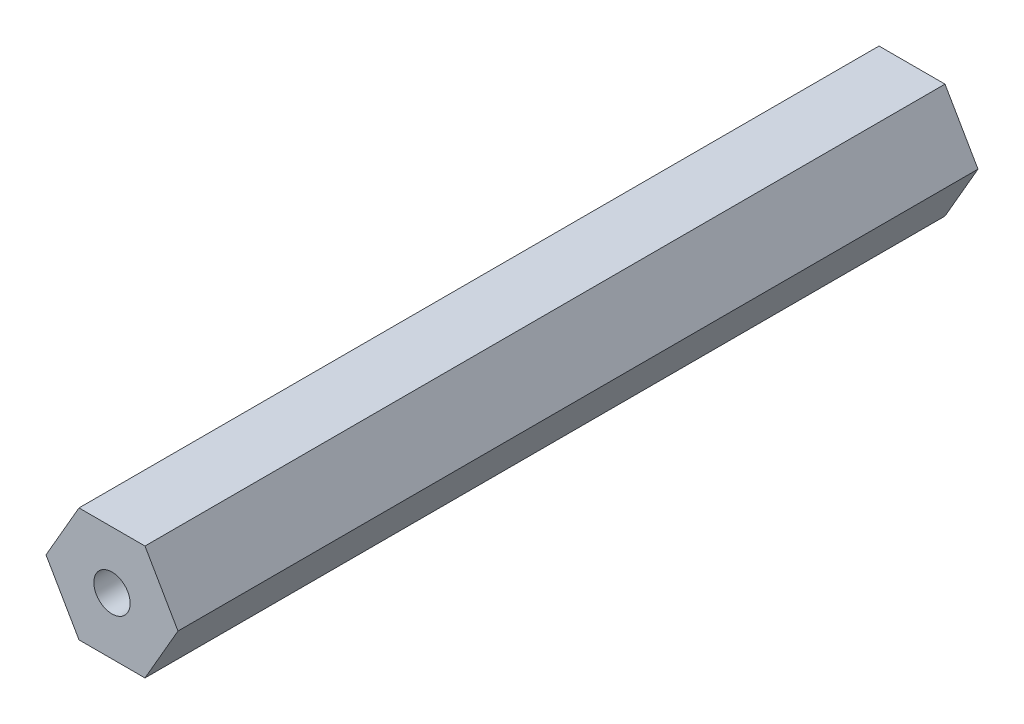
ISO-10303-21;
HEADER;
FILE_DESCRIPTION(('STEP AP214'),'2;1');
FILE_NAME('part.step','',(''),(''),'','','');
FILE_SCHEMA(('AUTOMOTIVE_DESIGN { 1 0 10303 214 1 1 1 1 }'));
ENDSEC;
DATA;
#1=APPLICATION_CONTEXT('core data for automotive mechanical design processes');
#2=APPLICATION_PROTOCOL_DEFINITION('international standard','automotive_design',2000,#1);
#3=PRODUCT_CONTEXT('',#1,'mechanical');
#4=PRODUCT('Part','Part','',(#3));
#5=PRODUCT_RELATED_PRODUCT_CATEGORY('part','',(#4));
#6=PRODUCT_DEFINITION_FORMATION('','',#4);
#7=PRODUCT_DEFINITION_CONTEXT('part definition',#1,'design');
#8=PRODUCT_DEFINITION('design','',#6,#7);
#9=PRODUCT_DEFINITION_SHAPE('','',#8);
#10=(LENGTH_UNIT() NAMED_UNIT(*) SI_UNIT(.MILLI.,.METRE.));
#11=(NAMED_UNIT(*) PLANE_ANGLE_UNIT() SI_UNIT($,.RADIAN.));
#12=(NAMED_UNIT(*) SI_UNIT($,.STERADIAN.) SOLID_ANGLE_UNIT());
#13=UNCERTAINTY_MEASURE_WITH_UNIT(LENGTH_MEASURE(1.E-05),#10,'distance_accuracy_value','');
#14=(GEOMETRIC_REPRESENTATION_CONTEXT(3) GLOBAL_UNCERTAINTY_ASSIGNED_CONTEXT((#13)) GLOBAL_UNIT_ASSIGNED_CONTEXT((#10,
#11,#12)) REPRESENTATION_CONTEXT('',''));
#15=CARTESIAN_POINT('',(0.,0.,0.));
#16=DIRECTION('',(0.,0.,1.));
#17=DIRECTION('',(1.,0.,0.));
#18=AXIS2_PLACEMENT_3D('',#15,#16,#17);
#19=CARTESIAN_POINT('',(3.66617420935412,-6.35,44.45));
#20=DIRECTION('',(-0.866025403784439,0.499999999999999,0.));
#21=DIRECTION('',(-0.499999999999999,-0.866025403784439,0.));
#22=AXIS2_PLACEMENT_3D('',#19,#20,#21);
#23=PLANE('',#22);
#24=DIRECTION('',(0.499999999999999,0.866025403784439,0.));
#25=VECTOR('',#24,1.);
#26=CARTESIAN_POINT('',(3.66617420935412,-6.35,-44.45));
#27=LINE('',#26,#25);
#28=CARTESIAN_POINT('',(3.66617420935412,-6.35,-44.45));
#29=VERTEX_POINT('',#28);
#30=CARTESIAN_POINT('',(7.33234841870824,0.,-44.45));
#31=VERTEX_POINT('',#30);
#32=EDGE_CURVE('E128',#29,#31,#27,.T.);
#33=ORIENTED_EDGE('',*,*,#32,.T.);
#34=DIRECTION('',(0.,0.,-1.));
#35=VECTOR('',#34,1.);
#36=CARTESIAN_POINT('',(7.33234841870824,0.,44.45));
#37=LINE('',#36,#35);
#38=CARTESIAN_POINT('',(7.33234841870824,0.,44.45));
#39=VERTEX_POINT('',#38);
#40=EDGE_CURVE('E11',#39,#31,#37,.T.);
#41=ORIENTED_EDGE('',*,*,#40,.F.);
#42=DIRECTION('',(0.499999999999999,0.866025403784439,0.));
#43=VECTOR('',#42,1.);
#44=CARTESIAN_POINT('',(3.66617420935412,-6.35,44.45));
#45=LINE('',#44,#43);
#46=CARTESIAN_POINT('',(3.66617420935412,-6.35,44.45));
#47=VERTEX_POINT('',#46);
#48=EDGE_CURVE('E139',#47,#39,#45,.T.);
#49=ORIENTED_EDGE('',*,*,#48,.F.);
#50=DIRECTION('',(0.,0.,-1.));
#51=VECTOR('',#50,1.);
#52=CARTESIAN_POINT('',(3.66617420935412,-6.35,44.45));
#53=LINE('',#52,#51);
#54=EDGE_CURVE('E124',#47,#29,#53,.T.);
#55=ORIENTED_EDGE('',*,*,#54,.T.);
#56=EDGE_LOOP('',(#33,#41,#49,#55));
#57=FACE_BOUND('',#56,.T.);
#58=ADVANCED_FACE('F41',(#57),#23,.F.);
#59=CARTESIAN_POINT('',(7.33234841870824,0.,44.45));
#60=DIRECTION('',(-0.866025403784438,-0.5,0.));
#61=DIRECTION('',(0.5,-0.866025403784439,0.));
#62=AXIS2_PLACEMENT_3D('',#59,#60,#61);
#63=PLANE('',#62);
#64=DIRECTION('',(-0.5,0.866025403784439,0.));
#65=VECTOR('',#64,1.);
#66=CARTESIAN_POINT('',(7.33234841870824,0.,-44.45));
#67=LINE('',#66,#65);
#68=CARTESIAN_POINT('',(3.66617420935412,6.35,-44.45));
#69=VERTEX_POINT('',#68);
#70=EDGE_CURVE('E131',#31,#69,#67,.T.);
#71=ORIENTED_EDGE('',*,*,#70,.T.);
#72=DIRECTION('',(0.,0.,-1.));
#73=VECTOR('',#72,1.);
#74=CARTESIAN_POINT('',(3.66617420935412,6.35,44.45));
#75=LINE('',#74,#73);
#76=CARTESIAN_POINT('',(3.66617420935412,6.35,44.45));
#77=VERTEX_POINT('',#76);
#78=EDGE_CURVE('E49',#77,#69,#75,.T.);
#79=ORIENTED_EDGE('',*,*,#78,.F.);
#80=DIRECTION('',(-0.5,0.866025403784439,0.));
#81=VECTOR('',#80,1.);
#82=CARTESIAN_POINT('',(7.33234841870824,0.,44.45));
#83=LINE('',#82,#81);
#84=EDGE_CURVE('E95',#39,#77,#83,.T.);
#85=ORIENTED_EDGE('',*,*,#84,.F.);
#86=ORIENTED_EDGE('',*,*,#40,.T.);
#87=EDGE_LOOP('',(#71,#79,#85,#86));
#88=FACE_BOUND('',#87,.T.);
#89=ADVANCED_FACE('F164',(#88),#63,.F.);
#90=CARTESIAN_POINT('',(3.66617420935412,6.35,44.45));
#91=DIRECTION('',(0.,-1.,0.));
#92=DIRECTION('',(1.,0.,0.));
#93=AXIS2_PLACEMENT_3D('',#90,#91,#92);
#94=PLANE('',#93);
#95=DIRECTION('',(-1.,0.,0.));
#96=VECTOR('',#95,1.);
#97=CARTESIAN_POINT('',(3.66617420935412,6.35,-44.45));
#98=LINE('',#97,#96);
#99=CARTESIAN_POINT('',(-3.66617420935412,6.35,-44.45));
#100=VERTEX_POINT('',#99);
#101=EDGE_CURVE('E134',#69,#100,#98,.T.);
#102=ORIENTED_EDGE('',*,*,#101,.T.);
#103=DIRECTION('',(0.,0.,-1.));
#104=VECTOR('',#103,1.);
#105=CARTESIAN_POINT('',(-3.66617420935412,6.35,44.45));
#106=LINE('',#105,#104);
#107=CARTESIAN_POINT('',(-3.66617420935412,6.35,44.45));
#108=VERTEX_POINT('',#107);
#109=EDGE_CURVE('E119',#108,#100,#106,.T.);
#110=ORIENTED_EDGE('',*,*,#109,.F.);
#111=DIRECTION('',(-1.,0.,0.));
#112=VECTOR('',#111,1.);
#113=CARTESIAN_POINT('',(3.66617420935412,6.35,44.45));
#114=LINE('',#113,#112);
#115=EDGE_CURVE('E110',#77,#108,#114,.T.);
#116=ORIENTED_EDGE('',*,*,#115,.F.);
#117=ORIENTED_EDGE('',*,*,#78,.T.);
#118=EDGE_LOOP('',(#102,#110,#116,#117));
#119=FACE_BOUND('',#118,.T.);
#120=ADVANCED_FACE('F145',(#119),#94,.F.);
#121=CARTESIAN_POINT('',(-3.66617420935412,6.35,44.45));
#122=DIRECTION('',(0.866025403784439,-0.499999999999999,0.));
#123=DIRECTION('',(0.5,0.866025403784439,0.));
#124=AXIS2_PLACEMENT_3D('',#121,#122,#123);
#125=PLANE('',#124);
#126=DIRECTION('',(-0.499999999999999,-0.866025403784439,0.));
#127=VECTOR('',#126,1.);
#128=CARTESIAN_POINT('',(-3.66617420935412,6.35,-44.45));
#129=LINE('',#128,#127);
#130=CARTESIAN_POINT('',(-7.33234841870824,0.,-44.45));
#131=VERTEX_POINT('',#130);
#132=EDGE_CURVE('E118',#100,#131,#129,.T.);
#133=ORIENTED_EDGE('',*,*,#132,.T.);
#134=DIRECTION('',(0.,0.,-1.));
#135=VECTOR('',#134,1.);
#136=CARTESIAN_POINT('',(-7.33234841870824,0.,44.45));
#137=LINE('',#136,#135);
#138=CARTESIAN_POINT('',(-7.33234841870824,0.,44.45));
#139=VERTEX_POINT('',#138);
#140=EDGE_CURVE('E115',#139,#131,#137,.T.);
#141=ORIENTED_EDGE('',*,*,#140,.F.);
#142=DIRECTION('',(-0.499999999999999,-0.866025403784439,0.));
#143=VECTOR('',#142,1.);
#144=CARTESIAN_POINT('',(-3.66617420935412,6.35,44.45));
#145=LINE('',#144,#143);
#146=EDGE_CURVE('E104',#108,#139,#145,.T.);
#147=ORIENTED_EDGE('',*,*,#146,.F.);
#148=ORIENTED_EDGE('',*,*,#109,.T.);
#149=EDGE_LOOP('',(#133,#141,#147,#148));
#150=FACE_BOUND('',#149,.T.);
#151=ADVANCED_FACE('F116',(#150),#125,.F.);
#152=CARTESIAN_POINT('',(-7.33234841870824,0.,44.45));
#153=DIRECTION('',(0.866025403784438,0.5,0.));
#154=DIRECTION('',(-0.5,0.866025403784438,0.));
#155=AXIS2_PLACEMENT_3D('',#152,#153,#154);
#156=PLANE('',#155);
#157=DIRECTION('',(0.5,-0.866025403784438,0.));
#158=VECTOR('',#157,1.);
#159=CARTESIAN_POINT('',(-7.33234841870824,0.,-44.45));
#160=LINE('',#159,#158);
#161=CARTESIAN_POINT('',(-3.66617420935412,-6.35,-44.45));
#162=VERTEX_POINT('',#161);
#163=EDGE_CURVE('E81',#131,#162,#160,.T.);
#164=ORIENTED_EDGE('',*,*,#163,.T.);
#165=DIRECTION('',(0.,0.,-1.));
#166=VECTOR('',#165,1.);
#167=CARTESIAN_POINT('',(-3.66617420935412,-6.35,44.45));
#168=LINE('',#167,#166);
#169=CARTESIAN_POINT('',(-3.66617420935412,-6.35,44.45));
#170=VERTEX_POINT('',#169);
#171=EDGE_CURVE('E120',#170,#162,#168,.T.);
#172=ORIENTED_EDGE('',*,*,#171,.F.);
#173=DIRECTION('',(0.5,-0.866025403784438,0.));
#174=VECTOR('',#173,1.);
#175=CARTESIAN_POINT('',(-7.33234841870824,0.,44.45));
#176=LINE('',#175,#174);
#177=EDGE_CURVE('E108',#139,#170,#176,.T.);
#178=ORIENTED_EDGE('',*,*,#177,.F.);
#179=ORIENTED_EDGE('',*,*,#140,.T.);
#180=EDGE_LOOP('',(#164,#172,#178,#179));
#181=FACE_BOUND('',#180,.T.);
#182=ADVANCED_FACE('F122',(#181),#156,.F.);
#183=CARTESIAN_POINT('',(-3.66617420935412,-6.35,44.45));
#184=DIRECTION('',(0.,1.,0.));
#185=DIRECTION('',(-1.,0.,0.));
#186=AXIS2_PLACEMENT_3D('',#183,#184,#185);
#187=PLANE('',#186);
#188=DIRECTION('',(1.,0.,0.));
#189=VECTOR('',#188,1.);
#190=CARTESIAN_POINT('',(-3.66617420935412,-6.35,-44.45));
#191=LINE('',#190,#189);
#192=EDGE_CURVE('E87',#162,#29,#191,.T.);
#193=ORIENTED_EDGE('',*,*,#192,.T.);
#194=ORIENTED_EDGE('',*,*,#54,.F.);
#195=DIRECTION('',(1.,0.,0.));
#196=VECTOR('',#195,1.);
#197=CARTESIAN_POINT('',(-3.66617420935412,-6.35,44.45));
#198=LINE('',#197,#196);
#199=EDGE_CURVE('E57',#170,#47,#198,.T.);
#200=ORIENTED_EDGE('',*,*,#199,.F.);
#201=ORIENTED_EDGE('',*,*,#171,.T.);
#202=EDGE_LOOP('',(#193,#194,#200,#201));
#203=FACE_BOUND('',#202,.T.);
#204=ADVANCED_FACE('F152',(#203),#187,.F.);
#205=CARTESIAN_POINT('',(0.,0.,44.45));
#206=DIRECTION('',(0.,0.,1.));
#207=DIRECTION('',(1.,0.,0.));
#208=AXIS2_PLACEMENT_3D('',#205,#206,#207);
#209=PLANE('',#208);
#210=CARTESIAN_POINT('',(0.,0.,44.45));
#211=DIRECTION('',(0.,0.,1.));
#212=DIRECTION('',(1.,0.,0.));
#213=AXIS2_PLACEMENT_3D('',#210,#211,#212);
#214=CIRCLE('',#213,2.01929999999999);
#215=CARTESIAN_POINT('',(2.01929999999999,0.,44.45));
#216=VERTEX_POINT('',#215);
#217=EDGE_CURVE('E266',#216,#216,#214,.T.);
#218=ORIENTED_EDGE('',*,*,#217,.F.);
#219=EDGE_LOOP('',(#218));
#220=FACE_BOUND('',#219,.T.);
#221=ORIENTED_EDGE('',*,*,#48,.T.);
#222=ORIENTED_EDGE('',*,*,#84,.T.);
#223=ORIENTED_EDGE('',*,*,#115,.T.);
#224=ORIENTED_EDGE('',*,*,#146,.T.);
#225=ORIENTED_EDGE('',*,*,#177,.T.);
#226=ORIENTED_EDGE('',*,*,#199,.T.);
#227=EDGE_LOOP('',(#221,#222,#223,#224,#225,#226));
#228=FACE_BOUND('',#227,.T.);
#229=ADVANCED_FACE('F106',(#220,#228),#209,.T.);
#230=CARTESIAN_POINT('',(0.,0.,-44.45));
#231=DIRECTION('',(0.,0.,1.));
#232=DIRECTION('',(1.,0.,0.));
#233=AXIS2_PLACEMENT_3D('',#230,#231,#232);
#234=PLANE('',#233);
#235=CARTESIAN_POINT('',(0.,0.,-44.45));
#236=DIRECTION('',(0.,0.,-1.));
#237=DIRECTION('',(-1.,0.,0.));
#238=AXIS2_PLACEMENT_3D('',#235,#236,#237);
#239=CIRCLE('',#238,2.01929999999999);
#240=CARTESIAN_POINT('',(-2.01929999999999,0.,-44.45));
#241=VERTEX_POINT('',#240);
#242=EDGE_CURVE('E268',#241,#241,#239,.T.);
#243=ORIENTED_EDGE('',*,*,#242,.F.);
#244=EDGE_LOOP('',(#243));
#245=FACE_BOUND('',#244,.T.);
#246=ORIENTED_EDGE('',*,*,#32,.F.);
#247=ORIENTED_EDGE('',*,*,#192,.F.);
#248=ORIENTED_EDGE('',*,*,#163,.F.);
#249=ORIENTED_EDGE('',*,*,#132,.F.);
#250=ORIENTED_EDGE('',*,*,#101,.F.);
#251=ORIENTED_EDGE('',*,*,#70,.F.);
#252=EDGE_LOOP('',(#246,#247,#248,#249,#250,#251));
#253=FACE_BOUND('',#252,.T.);
#254=ADVANCED_FACE('F148',(#245,#253),#234,.F.);
#255=CARTESIAN_POINT('',(0.,0.,-32.512));
#256=DIRECTION('',(0.,0.,-1.));
#257=DIRECTION('',(-1.,0.,0.));
#258=AXIS2_PLACEMENT_3D('',#255,#256,#257);
#259=CONICAL_SURFACE('',#258,2.01929999999999,1.02974425867665);
#260=CARTESIAN_POINT('',(0.,0.,-31.2986821519976));
#261=VERTEX_POINT('',#260);
#262=VERTEX_LOOP('',#261);
#263=FACE_BOUND('',#262,.T.);
#264=CARTESIAN_POINT('',(0.,0.,-32.512));
#265=DIRECTION('',(0.,0.,-1.));
#266=DIRECTION('',(-1.,0.,0.));
#267=AXIS2_PLACEMENT_3D('',#264,#265,#266);
#268=CIRCLE('',#267,2.01929999999999);
#269=CARTESIAN_POINT('',(-2.01929999999999,0.,-32.512));
#270=VERTEX_POINT('',#269);
#271=EDGE_CURVE('E132',#270,#270,#268,.T.);
#272=ORIENTED_EDGE('',*,*,#271,.T.);
#273=EDGE_LOOP('',(#272));
#274=FACE_BOUND('',#273,.T.);
#275=ADVANCED_FACE('F205',(#263,#274),#259,.F.);
#276=CARTESIAN_POINT('',(0.,0.,-44.45));
#277=DIRECTION('',(0.,0.,-1.));
#278=DIRECTION('',(-1.,0.,0.));
#279=AXIS2_PLACEMENT_3D('',#276,#277,#278);
#280=CYLINDRICAL_SURFACE('',#279,2.01929999999999);
#281=ORIENTED_EDGE('',*,*,#271,.F.);
#282=EDGE_LOOP('',(#281));
#283=FACE_BOUND('',#282,.T.);
#284=ORIENTED_EDGE('',*,*,#242,.T.);
#285=EDGE_LOOP('',(#284));
#286=FACE_BOUND('',#285,.T.);
#287=ADVANCED_FACE('F216',(#283,#286),#280,.F.);
#288=CARTESIAN_POINT('',(0.,0.,32.512));
#289=DIRECTION('',(0.,0.,1.));
#290=DIRECTION('',(1.,0.,0.));
#291=AXIS2_PLACEMENT_3D('',#288,#289,#290);
#292=CONICAL_SURFACE('',#291,2.01929999999999,1.02974425867665);
#293=CARTESIAN_POINT('',(0.,0.,31.2986821519976));
#294=VERTEX_POINT('',#293);
#295=VERTEX_LOOP('',#294);
#296=FACE_BOUND('',#295,.T.);
#297=CARTESIAN_POINT('',(0.,0.,32.512));
#298=DIRECTION('',(0.,0.,1.));
#299=DIRECTION('',(1.,0.,0.));
#300=AXIS2_PLACEMENT_3D('',#297,#298,#299);
#301=CIRCLE('',#300,2.01929999999999);
#302=CARTESIAN_POINT('',(2.01929999999999,0.,32.512));
#303=VERTEX_POINT('',#302);
#304=EDGE_CURVE('E263',#303,#303,#301,.T.);
#305=ORIENTED_EDGE('',*,*,#304,.T.);
#306=EDGE_LOOP('',(#305));
#307=FACE_BOUND('',#306,.T.);
#308=ADVANCED_FACE('F227',(#296,#307),#292,.F.);
#309=CARTESIAN_POINT('',(0.,0.,44.45));
#310=DIRECTION('',(0.,0.,1.));
#311=DIRECTION('',(1.,0.,0.));
#312=AXIS2_PLACEMENT_3D('',#309,#310,#311);
#313=CYLINDRICAL_SURFACE('',#312,2.01929999999999);
#314=ORIENTED_EDGE('',*,*,#304,.F.);
#315=EDGE_LOOP('',(#314));
#316=FACE_BOUND('',#315,.T.);
#317=ORIENTED_EDGE('',*,*,#217,.T.);
#318=EDGE_LOOP('',(#317));
#319=FACE_BOUND('',#318,.T.);
#320=ADVANCED_FACE('F238',(#316,#319),#313,.F.);
#321=CLOSED_SHELL('',(#58,#89,#120,#151,#182,#204,#229,#254,#275,#287,#308,#320));
#322=MANIFOLD_SOLID_BREP('B2',#321);
#323=ADVANCED_BREP_SHAPE_REPRESENTATION('',(#18,#322),#14);
#324=SHAPE_DEFINITION_REPRESENTATION(#9,#323);
ENDSEC;
END-ISO-10303-21;
